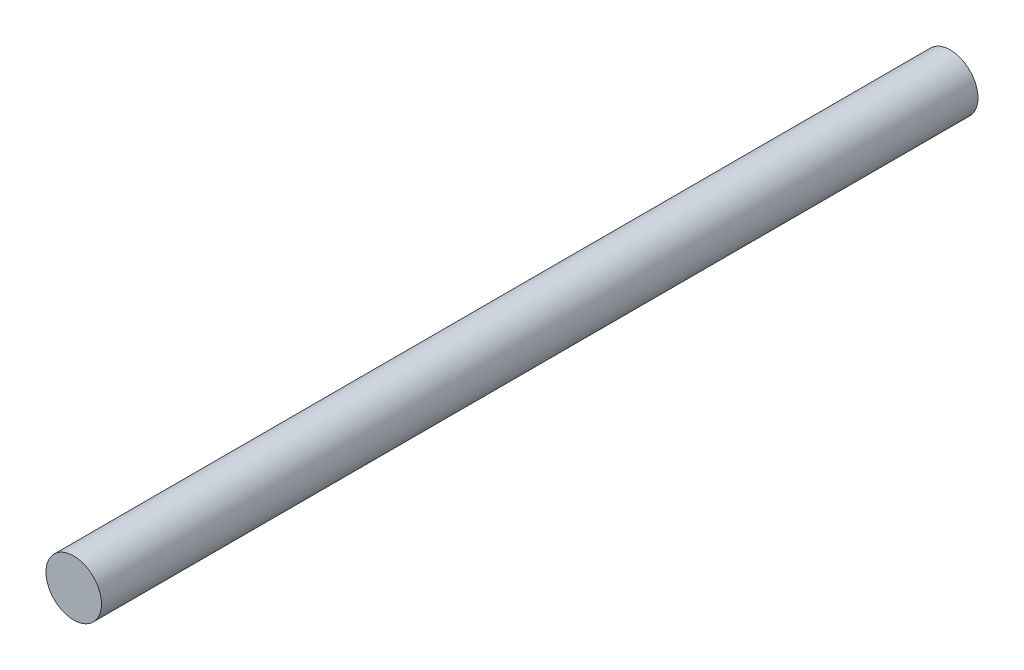
ISO-10303-21;
HEADER;
FILE_DESCRIPTION(('STEP AP214'),'2;1');
FILE_NAME('part.step','',(''),(''),'','','');
FILE_SCHEMA(('AUTOMOTIVE_DESIGN { 1 0 10303 214 1 1 1 1 }'));
ENDSEC;
DATA;
#1=APPLICATION_CONTEXT('core data for automotive mechanical design processes');
#2=APPLICATION_PROTOCOL_DEFINITION('international standard','automotive_design',2000,#1);
#3=PRODUCT_CONTEXT('',#1,'mechanical');
#4=PRODUCT('Part','Part','',(#3));
#5=PRODUCT_RELATED_PRODUCT_CATEGORY('part','',(#4));
#6=PRODUCT_DEFINITION_FORMATION('','',#4);
#7=PRODUCT_DEFINITION_CONTEXT('part definition',#1,'design');
#8=PRODUCT_DEFINITION('design','',#6,#7);
#9=PRODUCT_DEFINITION_SHAPE('','',#8);
#10=(LENGTH_UNIT() NAMED_UNIT(*) SI_UNIT(.MILLI.,.METRE.));
#11=(NAMED_UNIT(*) PLANE_ANGLE_UNIT() SI_UNIT($,.RADIAN.));
#12=(NAMED_UNIT(*) SI_UNIT($,.STERADIAN.) SOLID_ANGLE_UNIT());
#13=UNCERTAINTY_MEASURE_WITH_UNIT(LENGTH_MEASURE(1.E-05),#10,'distance_accuracy_value','');
#14=(GEOMETRIC_REPRESENTATION_CONTEXT(3) GLOBAL_UNCERTAINTY_ASSIGNED_CONTEXT((#13)) GLOBAL_UNIT_ASSIGNED_CONTEXT((#10,
#11,#12)) REPRESENTATION_CONTEXT('',''));
#15=CARTESIAN_POINT('',(0.,0.,0.));
#16=DIRECTION('',(0.,0.,1.));
#17=DIRECTION('',(1.,0.,0.));
#18=AXIS2_PLACEMENT_3D('',#15,#16,#17);
#19=CARTESIAN_POINT('',(0.,0.,75.));
#20=DIRECTION('',(0.,0.,-1.));
#21=DIRECTION('',(-1.,0.,0.));
#22=AXIS2_PLACEMENT_3D('',#19,#20,#21);
#23=CYLINDRICAL_SURFACE('',#22,2.375);
#24=CARTESIAN_POINT('',(0.,0.,75.));
#25=DIRECTION('',(0.,0.,1.));
#26=DIRECTION('',(1.,0.,0.));
#27=AXIS2_PLACEMENT_3D('',#24,#25,#26);
#28=CIRCLE('',#27,2.375);
#29=CARTESIAN_POINT('',(2.375,0.,75.));
#30=VERTEX_POINT('',#29);
#31=EDGE_CURVE('E10',#30,#30,#28,.T.);
#32=ORIENTED_EDGE('',*,*,#31,.F.);
#33=EDGE_LOOP('',(#32));
#34=FACE_BOUND('',#33,.T.);
#35=CARTESIAN_POINT('',(0.,0.,0.));
#36=DIRECTION('',(0.,0.,1.));
#37=DIRECTION('',(1.,0.,0.));
#38=AXIS2_PLACEMENT_3D('',#35,#36,#37);
#39=CIRCLE('',#38,2.375);
#40=CARTESIAN_POINT('',(2.375,0.,0.));
#41=VERTEX_POINT('',#40);
#42=EDGE_CURVE('E36',#41,#41,#39,.T.);
#43=ORIENTED_EDGE('',*,*,#42,.T.);
#44=EDGE_LOOP('',(#43));
#45=FACE_BOUND('',#44,.T.);
#46=ADVANCED_FACE('F33',(#34,#45),#23,.T.);
#47=CARTESIAN_POINT('',(0.,0.,75.));
#48=DIRECTION('',(0.,0.,1.));
#49=DIRECTION('',(1.,0.,0.));
#50=AXIS2_PLACEMENT_3D('',#47,#48,#49);
#51=PLANE('',#50);
#52=ORIENTED_EDGE('',*,*,#31,.T.);
#53=EDGE_LOOP('',(#52));
#54=FACE_BOUND('',#53,.T.);
#55=ADVANCED_FACE('F48',(#54),#51,.T.);
#56=CARTESIAN_POINT('',(0.,0.,0.));
#57=DIRECTION('',(0.,0.,1.));
#58=DIRECTION('',(1.,0.,0.));
#59=AXIS2_PLACEMENT_3D('',#56,#57,#58);
#60=PLANE('',#59);
#61=ORIENTED_EDGE('',*,*,#42,.F.);
#62=EDGE_LOOP('',(#61));
#63=FACE_BOUND('',#62,.T.);
#64=ADVANCED_FACE('F46',(#63),#60,.F.);
#65=CLOSED_SHELL('',(#46,#55,#64));
#66=MANIFOLD_SOLID_BREP('B2',#65);
#67=ADVANCED_BREP_SHAPE_REPRESENTATION('',(#18,#66),#14);
#68=SHAPE_DEFINITION_REPRESENTATION(#9,#67);
ENDSEC;
END-ISO-10303-21;
